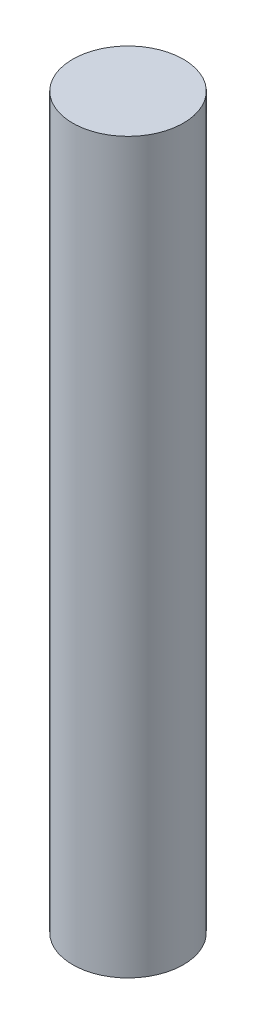
ISO-10303-21;
HEADER;
FILE_DESCRIPTION(('STEP AP214'),'2;1');
FILE_NAME('part.step','',(''),(''),'','','');
FILE_SCHEMA(('AUTOMOTIVE_DESIGN { 1 0 10303 214 1 1 1 1 }'));
ENDSEC;
DATA;
#1=APPLICATION_CONTEXT('core data for automotive mechanical design processes');
#2=APPLICATION_PROTOCOL_DEFINITION('international standard','automotive_design',2000,#1);
#3=PRODUCT_CONTEXT('',#1,'mechanical');
#4=PRODUCT('Part','Part','',(#3));
#5=PRODUCT_RELATED_PRODUCT_CATEGORY('part','',(#4));
#6=PRODUCT_DEFINITION_FORMATION('','',#4);
#7=PRODUCT_DEFINITION_CONTEXT('part definition',#1,'design');
#8=PRODUCT_DEFINITION('design','',#6,#7);
#9=PRODUCT_DEFINITION_SHAPE('','',#8);
#10=(LENGTH_UNIT() NAMED_UNIT(*) SI_UNIT(.MILLI.,.METRE.));
#11=(NAMED_UNIT(*) PLANE_ANGLE_UNIT() SI_UNIT($,.RADIAN.));
#12=(NAMED_UNIT(*) SI_UNIT($,.STERADIAN.) SOLID_ANGLE_UNIT());
#13=UNCERTAINTY_MEASURE_WITH_UNIT(LENGTH_MEASURE(1.E-05),#10,'distance_accuracy_value','');
#14=(GEOMETRIC_REPRESENTATION_CONTEXT(3) GLOBAL_UNCERTAINTY_ASSIGNED_CONTEXT((#13)) GLOBAL_UNIT_ASSIGNED_CONTEXT((#10,
#11,#12)) REPRESENTATION_CONTEXT('',''));
#15=CARTESIAN_POINT('',(0.,0.,0.));
#16=DIRECTION('',(0.,0.,1.));
#17=DIRECTION('',(1.,0.,0.));
#18=AXIS2_PLACEMENT_3D('',#15,#16,#17);
#19=CARTESIAN_POINT('',(0.,52.,0.));
#20=DIRECTION('',(0.,-1.,0.));
#21=DIRECTION('',(0.,0.,-1.));
#22=AXIS2_PLACEMENT_3D('',#19,#20,#21);
#23=CYLINDRICAL_SURFACE('',#22,3.95);
#24=CARTESIAN_POINT('',(0.,52.,0.));
#25=DIRECTION('',(0.,1.,0.));
#26=DIRECTION('',(0.,0.,1.));
#27=AXIS2_PLACEMENT_3D('',#24,#25,#26);
#28=CIRCLE('',#27,3.95);
#29=CARTESIAN_POINT('',(0.,52.,-3.95));
#30=VERTEX_POINT('',#29);
#31=EDGE_CURVE('E10',#30,#30,#28,.T.);
#32=CARTESIAN_POINT('',(0.,0.,0.));
#33=DIRECTION('',(0.,1.,0.));
#34=DIRECTION('',(0.,0.,1.));
#35=AXIS2_PLACEMENT_3D('',#32,#33,#34);
#36=CIRCLE('',#35,3.95);
#37=CARTESIAN_POINT('',(0.,0.,-3.95));
#38=VERTEX_POINT('',#37);
#39=EDGE_CURVE('E40',#38,#38,#36,.T.);
#40=CARTESIAN_POINT('',(0.,52.,-3.95));
#41=CARTESIAN_POINT('',(0.,51.4583333333333,-3.95));
#42=CARTESIAN_POINT('',(0.,50.9166666666667,-3.95));
#43=CARTESIAN_POINT('',(0.,49.8333333333333,-3.95));
#44=CARTESIAN_POINT('',(0.,49.2916666666667,-3.95));
#45=CARTESIAN_POINT('',(0.,48.2083333333333,-3.95));
#46=CARTESIAN_POINT('',(0.,47.6666666666667,-3.95));
#47=CARTESIAN_POINT('',(0.,46.5833333333333,-3.95));
#48=CARTESIAN_POINT('',(0.,46.0416666666667,-3.95));
#49=CARTESIAN_POINT('',(0.,44.9583333333333,-3.95));
#50=CARTESIAN_POINT('',(0.,44.4166666666667,-3.95));
#51=CARTESIAN_POINT('',(0.,43.3333333333333,-3.95));
#52=CARTESIAN_POINT('',(0.,42.7916666666667,-3.95));
#53=CARTESIAN_POINT('',(0.,41.7083333333333,-3.95));
#54=CARTESIAN_POINT('',(0.,41.1666666666667,-3.95));
#55=CARTESIAN_POINT('',(0.,40.0833333333333,-3.95));
#56=CARTESIAN_POINT('',(0.,39.5416666666667,-3.95));
#57=CARTESIAN_POINT('',(0.,38.4583333333333,-3.95));
#58=CARTESIAN_POINT('',(0.,37.9166666666667,-3.95));
#59=CARTESIAN_POINT('',(0.,36.8333333333333,-3.95));
#60=CARTESIAN_POINT('',(0.,36.2916666666667,-3.95));
#61=CARTESIAN_POINT('',(0.,35.2083333333333,-3.95));
#62=CARTESIAN_POINT('',(0.,34.6666666666667,-3.95));
#63=CARTESIAN_POINT('',(0.,33.5833333333333,-3.95));
#64=CARTESIAN_POINT('',(0.,33.0416666666667,-3.95));
#65=CARTESIAN_POINT('',(0.,31.9583333333333,-3.95));
#66=CARTESIAN_POINT('',(0.,31.4166666666667,-3.95));
#67=CARTESIAN_POINT('',(0.,30.3333333333333,-3.95));
#68=CARTESIAN_POINT('',(0.,29.7916666666667,-3.95));
#69=CARTESIAN_POINT('',(0.,28.7083333333333,-3.95));
#70=CARTESIAN_POINT('',(0.,28.1666666666667,-3.95));
#71=CARTESIAN_POINT('',(0.,27.0833333333333,-3.95));
#72=CARTESIAN_POINT('',(0.,26.5416666666667,-3.95));
#73=CARTESIAN_POINT('',(0.,25.4583333333333,-3.95));
#74=CARTESIAN_POINT('',(0.,24.9166666666667,-3.95));
#75=CARTESIAN_POINT('',(0.,23.8333333333333,-3.95));
#76=CARTESIAN_POINT('',(0.,23.2916666666667,-3.95));
#77=CARTESIAN_POINT('',(0.,22.2083333333333,-3.95));
#78=CARTESIAN_POINT('',(0.,21.6666666666667,-3.95));
#79=CARTESIAN_POINT('',(0.,20.5833333333333,-3.95));
#80=CARTESIAN_POINT('',(0.,20.0416666666667,-3.95));
#81=CARTESIAN_POINT('',(0.,18.9583333333333,-3.95));
#82=CARTESIAN_POINT('',(0.,18.4166666666667,-3.95));
#83=CARTESIAN_POINT('',(0.,17.3333333333333,-3.95));
#84=CARTESIAN_POINT('',(0.,16.7916666666667,-3.95));
#85=CARTESIAN_POINT('',(0.,15.7083333333333,-3.95));
#86=CARTESIAN_POINT('',(0.,15.1666666666667,-3.95));
#87=CARTESIAN_POINT('',(0.,14.0833333333333,-3.95));
#88=CARTESIAN_POINT('',(0.,13.5416666666667,-3.95));
#89=CARTESIAN_POINT('',(0.,12.4583333333333,-3.95));
#90=CARTESIAN_POINT('',(0.,11.9166666666667,-3.95));
#91=CARTESIAN_POINT('',(0.,10.8333333333333,-3.95));
#92=CARTESIAN_POINT('',(0.,10.2916666666667,-3.95));
#93=CARTESIAN_POINT('',(0.,9.20833333333333,-3.95));
#94=CARTESIAN_POINT('',(0.,8.66666666666667,-3.95));
#95=CARTESIAN_POINT('',(0.,7.58333333333333,-3.95));
#96=CARTESIAN_POINT('',(0.,7.04166666666667,-3.95));
#97=CARTESIAN_POINT('',(0.,5.95833333333333,-3.95));
#98=CARTESIAN_POINT('',(0.,5.41666666666667,-3.95));
#99=CARTESIAN_POINT('',(0.,4.33333333333333,-3.95));
#100=CARTESIAN_POINT('',(0.,3.79166666666667,-3.95));
#101=CARTESIAN_POINT('',(0.,2.70833333333334,-3.95));
#102=CARTESIAN_POINT('',(0.,2.16666666666667,-3.95));
#103=CARTESIAN_POINT('',(0.,1.08333333333333,-3.95));
#104=CARTESIAN_POINT('',(0.,0.541666666666667,-3.95));
#105=CARTESIAN_POINT('',(0.,0.,-3.95));
#106=B_SPLINE_CURVE_WITH_KNOTS('',3,(#40,#41,#42,#43,#44,#45,#46,#47,#48,#49,#50,#51,#52,#53,
#54,#55,#56,#57,#58,#59,#60,#61,#62,#63,#64,#65,#66,#67,#68,#69,#70,#71,#72,#73,#74,#75,#76,#77,
#78,#79,#80,#81,#82,#83,#84,#85,#86,#87,#88,#89,#90,#91,#92,#93,#94,#95,#96,#97,#98,#99,#100,
#101,#102,#103,#104,#105),.UNSPECIFIED.,.F.,.F.,(4,2,2,2,2,2,2,2,2,2,2,2,2,2,2,2,2,2,2,2,2,2,2,
2,2,2,2,2,2,2,2,2,4),(0.,1.625,3.25,4.875,6.50000000000001,8.125,9.75,11.375,13.,14.625,16.25,
17.875,19.5,21.125,22.75,24.375,26.,27.625,29.25,30.875,32.5,34.125,35.75,37.375,39.,40.625,
42.25,43.875,45.5,47.125,48.75,50.375,52.),.UNSPECIFIED.);
#107=EDGE_CURVE('BSEAM37',#30,#38,#106,.T.);
#108=ORIENTED_EDGE('',*,*,#31,.F.);
#109=ORIENTED_EDGE('',*,*,#39,.T.);
#110=ORIENTED_EDGE('',*,*,#107,.T.);
#111=ORIENTED_EDGE('',*,*,#107,.F.);
#112=EDGE_LOOP('',(#108,#110,#109,#111));
#113=FACE_BOUND('',#112,.T.);
#114=ADVANCED_FACE('F37',(#113),#23,.T.);
#115=CARTESIAN_POINT('',(0.,52.,0.));
#116=DIRECTION('',(0.,1.,0.));
#117=DIRECTION('',(0.,0.,1.));
#118=AXIS2_PLACEMENT_3D('',#115,#116,#117);
#119=PLANE('',#118);
#120=ORIENTED_EDGE('',*,*,#31,.T.);
#121=EDGE_LOOP('',(#120));
#122=FACE_BOUND('',#121,.T.);
#123=ADVANCED_FACE('F54',(#122),#119,.T.);
#124=CARTESIAN_POINT('',(0.,0.,0.));
#125=DIRECTION('',(0.,1.,0.));
#126=DIRECTION('',(0.,0.,1.));
#127=AXIS2_PLACEMENT_3D('',#124,#125,#126);
#128=PLANE('',#127);
#129=ORIENTED_EDGE('',*,*,#39,.F.);
#130=EDGE_LOOP('',(#129));
#131=FACE_BOUND('',#130,.T.);
#132=ADVANCED_FACE('F52',(#131),#128,.F.);
#133=CLOSED_SHELL('',(#114,#123,#132));
#134=MANIFOLD_SOLID_BREP('B2',#133);
#135=ADVANCED_BREP_SHAPE_REPRESENTATION('',(#18,#134),#14);
#136=SHAPE_DEFINITION_REPRESENTATION(#9,#135);
ENDSEC;
END-ISO-10303-21;
